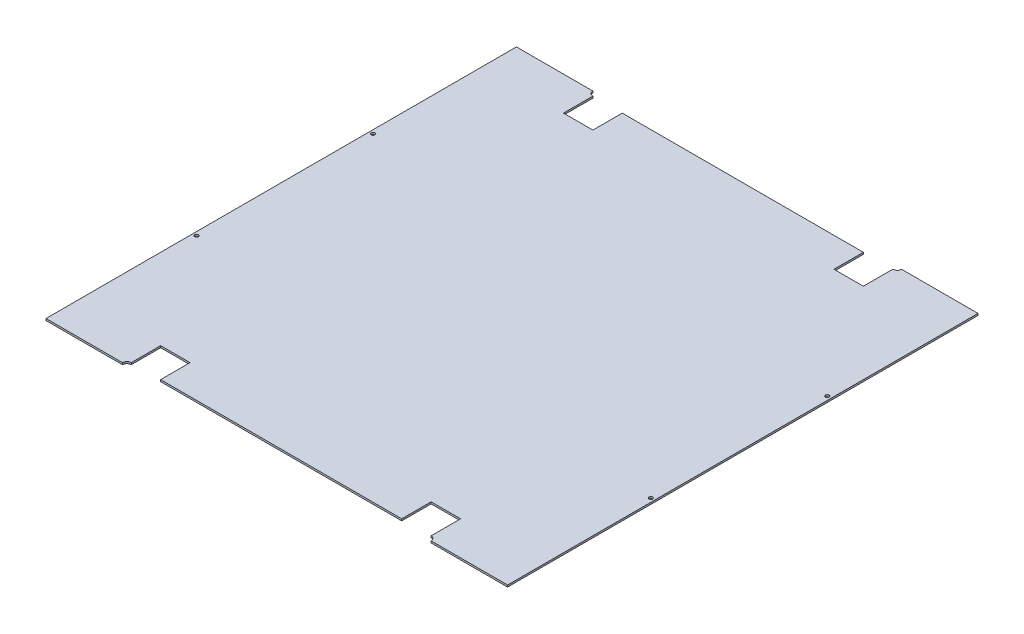
ISO-10303-21;
HEADER;
FILE_DESCRIPTION(('STEP AP214'),'2;1');
FILE_NAME('part.step','',(''),(''),'','','');
FILE_SCHEMA(('AUTOMOTIVE_DESIGN { 1 0 10303 214 1 1 1 1 }'));
ENDSEC;
DATA;
#1=APPLICATION_CONTEXT('core data for automotive mechanical design processes');
#2=APPLICATION_PROTOCOL_DEFINITION('international standard','automotive_design',2000,#1);
#3=PRODUCT_CONTEXT('',#1,'mechanical');
#4=PRODUCT('Part','Part','',(#3));
#5=PRODUCT_RELATED_PRODUCT_CATEGORY('part','',(#4));
#6=PRODUCT_DEFINITION_FORMATION('','',#4);
#7=PRODUCT_DEFINITION_CONTEXT('part definition',#1,'design');
#8=PRODUCT_DEFINITION('design','',#6,#7);
#9=PRODUCT_DEFINITION_SHAPE('','',#8);
#10=(LENGTH_UNIT() NAMED_UNIT(*) SI_UNIT(.MILLI.,.METRE.));
#11=(NAMED_UNIT(*) PLANE_ANGLE_UNIT() SI_UNIT($,.RADIAN.));
#12=(NAMED_UNIT(*) SI_UNIT($,.STERADIAN.) SOLID_ANGLE_UNIT());
#13=UNCERTAINTY_MEASURE_WITH_UNIT(LENGTH_MEASURE(1.E-05),#10,'distance_accuracy_value','');
#14=(GEOMETRIC_REPRESENTATION_CONTEXT(3) GLOBAL_UNCERTAINTY_ASSIGNED_CONTEXT((#13)) GLOBAL_UNIT_ASSIGNED_CONTEXT((#10,
#11,#12)) REPRESENTATION_CONTEXT('',''));
#15=CARTESIAN_POINT('',(0.,0.,0.));
#16=DIRECTION('',(0.,0.,1.));
#17=DIRECTION('',(1.,0.,0.));
#18=AXIS2_PLACEMENT_3D('',#15,#16,#17);
#19=CARTESIAN_POINT('',(126.537845956828,1.5875,-206.259520043997));
#20=DIRECTION('',(0.,-1.,0.));
#21=DIRECTION('',(0.,0.,-1.));
#22=AXIS2_PLACEMENT_3D('',#19,#20,#21);
#23=CYLINDRICAL_SURFACE('',#22,3.81000000000001);
#24=CARTESIAN_POINT('',(126.537845956828,0.,-206.259520043997));
#25=DIRECTION('',(0.,1.,0.));
#26=DIRECTION('',(0.,0.,1.));
#27=AXIS2_PLACEMENT_3D('',#24,#25,#26);
#28=CIRCLE('',#27,3.81000000000001);
#29=CARTESIAN_POINT('',(126.537845956828,0.,-202.449520043997));
#30=VERTEX_POINT('',#29);
#31=CARTESIAN_POINT('',(130.347845956828,0.,-206.259520043997));
#32=VERTEX_POINT('',#31);
#33=EDGE_CURVE('E231',#30,#32,#28,.T.);
#34=ORIENTED_EDGE('',*,*,#33,.F.);
#35=DIRECTION('',(0.,-1.,0.));
#36=VECTOR('',#35,1.);
#37=CARTESIAN_POINT('',(126.537845956828,1.5875,-202.449520043997));
#38=LINE('',#37,#36);
#39=CARTESIAN_POINT('',(126.537845956828,1.5875,-202.449520043997));
#40=VERTEX_POINT('',#39);
#41=EDGE_CURVE('E11',#40,#30,#38,.T.);
#42=ORIENTED_EDGE('',*,*,#41,.F.);
#43=CARTESIAN_POINT('',(126.537845956828,1.5875,-206.259520043997));
#44=DIRECTION('',(0.,1.,0.));
#45=DIRECTION('',(0.,0.,1.));
#46=AXIS2_PLACEMENT_3D('',#43,#44,#45);
#47=CIRCLE('',#46,3.81000000000001);
#48=CARTESIAN_POINT('',(130.347845956828,1.5875,-206.259520043997));
#49=VERTEX_POINT('',#48);
#50=EDGE_CURVE('E361',#40,#49,#47,.T.);
#51=ORIENTED_EDGE('',*,*,#50,.T.);
#52=DIRECTION('',(0.,-1.,0.));
#53=VECTOR('',#52,1.);
#54=CARTESIAN_POINT('',(130.347845956828,1.5875,-206.259520043997));
#55=LINE('',#54,#53);
#56=EDGE_CURVE('E55',#49,#32,#55,.T.);
#57=ORIENTED_EDGE('',*,*,#56,.T.);
#58=EDGE_LOOP('',(#34,#42,#51,#57));
#59=FACE_BOUND('',#58,.T.);
#60=ADVANCED_FACE('F39',(#59),#23,.F.);
#61=CARTESIAN_POINT('',(126.537845956828,1.5875,1.2023727325209E-13));
#62=DIRECTION('',(1.,0.,0.));
#63=DIRECTION('',(0.,0.,-1.));
#64=AXIS2_PLACEMENT_3D('',#61,#62,#63);
#65=PLANE('',#64);
#66=DIRECTION('',(0.,0.,1.));
#67=VECTOR('',#66,1.);
#68=CARTESIAN_POINT('',(126.537845956828,0.,1.2023727325209E-13));
#69=LINE('',#68,#67);
#70=CARTESIAN_POINT('',(126.537845956828,0.,-177.049520043997));
#71=VERTEX_POINT('',#70);
#72=EDGE_CURVE('E233',#30,#71,#69,.T.);
#73=ORIENTED_EDGE('',*,*,#72,.T.);
#74=DIRECTION('',(0.,-1.,0.));
#75=VECTOR('',#74,1.);
#76=CARTESIAN_POINT('',(126.537845956828,1.5875,-177.049520043997));
#77=LINE('',#76,#75);
#78=CARTESIAN_POINT('',(126.537845956828,1.5875,-177.049520043997));
#79=VERTEX_POINT('',#78);
#80=EDGE_CURVE('E47',#79,#71,#77,.T.);
#81=ORIENTED_EDGE('',*,*,#80,.F.);
#82=DIRECTION('',(0.,0.,1.));
#83=VECTOR('',#82,1.);
#84=CARTESIAN_POINT('',(126.537845956828,1.5875,1.2023727325209E-13));
#85=LINE('',#84,#83);
#86=EDGE_CURVE('E357',#40,#79,#85,.T.);
#87=ORIENTED_EDGE('',*,*,#86,.F.);
#88=ORIENTED_EDGE('',*,*,#41,.T.);
#89=EDGE_LOOP('',(#73,#81,#87,#88));
#90=FACE_BOUND('',#89,.T.);
#91=ADVANCED_FACE('F344',(#90),#65,.F.);
#92=CARTESIAN_POINT('',(-1.93468950444566E-13,1.5875,-177.049520043997));
#93=DIRECTION('',(0.,0.,-1.));
#94=DIRECTION('',(-1.,0.,0.));
#95=AXIS2_PLACEMENT_3D('',#92,#93,#94);
#96=PLANE('',#95);
#97=DIRECTION('',(1.,0.,0.));
#98=VECTOR('',#97,1.);
#99=CARTESIAN_POINT('',(-1.93468950444566E-13,0.,-177.049520043997));
#100=LINE('',#99,#98);
#101=CARTESIAN_POINT('',(101.137845956828,0.,-177.049520043997));
#102=VERTEX_POINT('',#101);
#103=EDGE_CURVE('E237',#102,#71,#100,.T.);
#104=ORIENTED_EDGE('',*,*,#103,.F.);
#105=DIRECTION('',(0.,-1.,0.));
#106=VECTOR('',#105,1.);
#107=CARTESIAN_POINT('',(101.137845956828,1.5875,-177.049520043997));
#108=LINE('',#107,#106);
#109=CARTESIAN_POINT('',(101.137845956828,1.5875,-177.049520043997));
#110=VERTEX_POINT('',#109);
#111=EDGE_CURVE('E334',#110,#102,#108,.T.);
#112=ORIENTED_EDGE('',*,*,#111,.F.);
#113=DIRECTION('',(1.,0.,0.));
#114=VECTOR('',#113,1.);
#115=CARTESIAN_POINT('',(-1.93468950444566E-13,1.5875,-177.049520043997));
#116=LINE('',#115,#114);
#117=EDGE_CURVE('E341',#110,#79,#116,.T.);
#118=ORIENTED_EDGE('',*,*,#117,.T.);
#119=ORIENTED_EDGE('',*,*,#80,.T.);
#120=EDGE_LOOP('',(#104,#112,#118,#119));
#121=FACE_BOUND('',#120,.T.);
#122=ADVANCED_FACE('F339',(#121),#96,.T.);
#123=CARTESIAN_POINT('',(101.137845956828,1.5875,0.));
#124=DIRECTION('',(1.,0.,0.));
#125=DIRECTION('',(0.,0.,-1.));
#126=AXIS2_PLACEMENT_3D('',#123,#124,#125);
#127=PLANE('',#126);
#128=DIRECTION('',(0.,0.,1.));
#129=VECTOR('',#128,1.);
#130=CARTESIAN_POINT('',(101.137845956828,0.,0.));
#131=LINE('',#130,#129);
#132=CARTESIAN_POINT('',(101.137845956828,0.,-202.449520043997));
#133=VERTEX_POINT('',#132);
#134=EDGE_CURVE('E240',#133,#102,#131,.T.);
#135=ORIENTED_EDGE('',*,*,#134,.F.);
#136=DIRECTION('',(0.,-1.,0.));
#137=VECTOR('',#136,1.);
#138=CARTESIAN_POINT('',(101.137845956828,1.5875,-202.449520043997));
#139=LINE('',#138,#137);
#140=CARTESIAN_POINT('',(101.137845956828,1.5875,-202.449520043997));
#141=VERTEX_POINT('',#140);
#142=EDGE_CURVE('E332',#141,#133,#139,.T.);
#143=ORIENTED_EDGE('',*,*,#142,.F.);
#144=DIRECTION('',(0.,0.,1.));
#145=VECTOR('',#144,1.);
#146=CARTESIAN_POINT('',(101.137845956828,1.5875,0.));
#147=LINE('',#146,#145);
#148=EDGE_CURVE('E354',#141,#110,#147,.T.);
#149=ORIENTED_EDGE('',*,*,#148,.T.);
#150=ORIENTED_EDGE('',*,*,#111,.T.);
#151=EDGE_LOOP('',(#135,#143,#149,#150));
#152=FACE_BOUND('',#151,.T.);
#153=ADVANCED_FACE('F351',(#152),#127,.T.);
#154=CARTESIAN_POINT('',(0.,1.5875,-202.449520043997));
#155=DIRECTION('',(0.,0.,-1.));
#156=DIRECTION('',(-1.,0.,0.));
#157=AXIS2_PLACEMENT_3D('',#154,#155,#156);
#158=PLANE('',#157);
#159=DIRECTION('',(1.,0.,0.));
#160=VECTOR('',#159,1.);
#161=CARTESIAN_POINT('',(0.,0.,-202.449520043997));
#162=LINE('',#161,#160);
#163=CARTESIAN_POINT('',(-107.142154043172,0.,-202.449520043997));
#164=VERTEX_POINT('',#163);
#165=EDGE_CURVE('E243',#164,#133,#162,.T.);
#166=ORIENTED_EDGE('',*,*,#165,.F.);
#167=DIRECTION('',(0.,-1.,0.));
#168=VECTOR('',#167,1.);
#169=CARTESIAN_POINT('',(-107.142154043172,1.5875,-202.449520043997));
#170=LINE('',#169,#168);
#171=CARTESIAN_POINT('',(-107.142154043172,1.5875,-202.449520043997));
#172=VERTEX_POINT('',#171);
#173=EDGE_CURVE('E330',#172,#164,#170,.T.);
#174=ORIENTED_EDGE('',*,*,#173,.F.);
#175=DIRECTION('',(1.,0.,0.));
#176=VECTOR('',#175,1.);
#177=CARTESIAN_POINT('',(0.,1.5875,-202.449520043997));
#178=LINE('',#177,#176);
#179=EDGE_CURVE('E359',#172,#141,#178,.T.);
#180=ORIENTED_EDGE('',*,*,#179,.T.);
#181=ORIENTED_EDGE('',*,*,#142,.T.);
#182=EDGE_LOOP('',(#166,#174,#180,#181));
#183=FACE_BOUND('',#182,.T.);
#184=ADVANCED_FACE('F467',(#183),#158,.T.);
#185=CARTESIAN_POINT('',(-107.142154043172,1.5875,1.52710997509413E-13));
#186=DIRECTION('',(1.,0.,0.));
#187=DIRECTION('',(0.,0.,-1.));
#188=AXIS2_PLACEMENT_3D('',#185,#186,#187);
#189=PLANE('',#188);
#190=DIRECTION('',(0.,0.,1.));
#191=VECTOR('',#190,1.);
#192=CARTESIAN_POINT('',(-107.142154043172,0.,1.52710997509413E-13));
#193=LINE('',#192,#191);
#194=CARTESIAN_POINT('',(-107.142154043172,0.,-177.049520043997));
#195=VERTEX_POINT('',#194);
#196=EDGE_CURVE('E246',#164,#195,#193,.T.);
#197=ORIENTED_EDGE('',*,*,#196,.T.);
#198=DIRECTION('',(0.,-1.,0.));
#199=VECTOR('',#198,1.);
#200=CARTESIAN_POINT('',(-107.142154043172,1.5875,-177.049520043997));
#201=LINE('',#200,#199);
#202=CARTESIAN_POINT('',(-107.142154043172,1.5875,-177.049520043997));
#203=VERTEX_POINT('',#202);
#204=EDGE_CURVE('E328',#203,#195,#201,.T.);
#205=ORIENTED_EDGE('',*,*,#204,.F.);
#206=DIRECTION('',(0.,0.,1.));
#207=VECTOR('',#206,1.);
#208=CARTESIAN_POINT('',(-107.142154043172,1.5875,1.52710997509413E-13));
#209=LINE('',#208,#207);
#210=EDGE_CURVE('E366',#172,#203,#209,.T.);
#211=ORIENTED_EDGE('',*,*,#210,.F.);
#212=ORIENTED_EDGE('',*,*,#173,.T.);
#213=EDGE_LOOP('',(#197,#205,#211,#212));
#214=FACE_BOUND('',#213,.T.);
#215=ADVANCED_FACE('F470',(#214),#189,.F.);
#216=CARTESIAN_POINT('',(0.,1.5875,-177.049520043997));
#217=DIRECTION('',(0.,0.,-1.));
#218=DIRECTION('',(-1.,0.,0.));
#219=AXIS2_PLACEMENT_3D('',#216,#217,#218);
#220=PLANE('',#219);
#221=DIRECTION('',(1.,0.,0.));
#222=VECTOR('',#221,1.);
#223=CARTESIAN_POINT('',(0.,0.,-177.049520043997));
#224=LINE('',#223,#222);
#225=CARTESIAN_POINT('',(-132.542154043172,0.,-177.049520043997));
#226=VERTEX_POINT('',#225);
#227=EDGE_CURVE('E249',#226,#195,#224,.T.);
#228=ORIENTED_EDGE('',*,*,#227,.F.);
#229=DIRECTION('',(0.,-1.,0.));
#230=VECTOR('',#229,1.);
#231=CARTESIAN_POINT('',(-132.542154043172,1.5875,-177.049520043997));
#232=LINE('',#231,#230);
#233=CARTESIAN_POINT('',(-132.542154043172,1.5875,-177.049520043997));
#234=VERTEX_POINT('',#233);
#235=EDGE_CURVE('E326',#234,#226,#232,.T.);
#236=ORIENTED_EDGE('',*,*,#235,.F.);
#237=DIRECTION('',(1.,0.,0.));
#238=VECTOR('',#237,1.);
#239=CARTESIAN_POINT('',(0.,1.5875,-177.049520043997));
#240=LINE('',#239,#238);
#241=EDGE_CURVE('E368',#234,#203,#240,.T.);
#242=ORIENTED_EDGE('',*,*,#241,.T.);
#243=ORIENTED_EDGE('',*,*,#204,.T.);
#244=EDGE_LOOP('',(#228,#236,#242,#243));
#245=FACE_BOUND('',#244,.T.);
#246=ADVANCED_FACE('F474',(#245),#220,.T.);
#247=CARTESIAN_POINT('',(-132.542154043172,1.5875,1.25942614816967E-13));
#248=DIRECTION('',(1.,0.,0.));
#249=DIRECTION('',(0.,0.,-1.));
#250=AXIS2_PLACEMENT_3D('',#247,#248,#249);
#251=PLANE('',#250);
#252=DIRECTION('',(0.,0.,1.));
#253=VECTOR('',#252,1.);
#254=CARTESIAN_POINT('',(-132.542154043172,0.,1.25942614816967E-13));
#255=LINE('',#254,#253);
#256=CARTESIAN_POINT('',(-132.542154043172,0.,-202.449520043997));
#257=VERTEX_POINT('',#256);
#258=EDGE_CURVE('E252',#257,#226,#255,.T.);
#259=ORIENTED_EDGE('',*,*,#258,.F.);
#260=DIRECTION('',(0.,-1.,0.));
#261=VECTOR('',#260,1.);
#262=CARTESIAN_POINT('',(-132.542154043172,1.5875,-202.449520043997));
#263=LINE('',#262,#261);
#264=CARTESIAN_POINT('',(-132.542154043172,1.5875,-202.449520043997));
#265=VERTEX_POINT('',#264);
#266=EDGE_CURVE('E324',#265,#257,#263,.T.);
#267=ORIENTED_EDGE('',*,*,#266,.F.);
#268=DIRECTION('',(0.,0.,1.));
#269=VECTOR('',#268,1.);
#270=CARTESIAN_POINT('',(-132.542154043172,1.5875,1.25942614816967E-13));
#271=LINE('',#270,#269);
#272=EDGE_CURVE('E371',#265,#234,#271,.T.);
#273=ORIENTED_EDGE('',*,*,#272,.T.);
#274=ORIENTED_EDGE('',*,*,#235,.T.);
#275=EDGE_LOOP('',(#259,#267,#273,#274));
#276=FACE_BOUND('',#275,.T.);
#277=ADVANCED_FACE('F478',(#276),#251,.T.);
#278=CARTESIAN_POINT('',(-132.542154043172,1.5875,-206.259520043997));
#279=DIRECTION('',(0.,-1.,0.));
#280=DIRECTION('',(0.,0.,-1.));
#281=AXIS2_PLACEMENT_3D('',#278,#279,#280);
#282=CYLINDRICAL_SURFACE('',#281,3.81000000000001);
#283=CARTESIAN_POINT('',(-132.542154043172,0.,-206.259520043997));
#284=DIRECTION('',(0.,1.,0.));
#285=DIRECTION('',(0.,0.,1.));
#286=AXIS2_PLACEMENT_3D('',#283,#284,#285);
#287=CIRCLE('',#286,3.81000000000001);
#288=CARTESIAN_POINT('',(-136.352154043172,0.,-206.259520043997));
#289=VERTEX_POINT('',#288);
#290=EDGE_CURVE('E255',#289,#257,#287,.T.);
#291=ORIENTED_EDGE('',*,*,#290,.F.);
#292=DIRECTION('',(0.,-1.,0.));
#293=VECTOR('',#292,1.);
#294=CARTESIAN_POINT('',(-136.352154043172,1.5875,-206.259520043997));
#295=LINE('',#294,#293);
#296=CARTESIAN_POINT('',(-136.352154043172,1.5875,-206.259520043997));
#297=VERTEX_POINT('',#296);
#298=EDGE_CURVE('E322',#297,#289,#295,.T.);
#299=ORIENTED_EDGE('',*,*,#298,.F.);
#300=CARTESIAN_POINT('',(-132.542154043172,1.5875,-206.259520043997));
#301=DIRECTION('',(0.,1.,0.));
#302=DIRECTION('',(0.,0.,1.));
#303=AXIS2_PLACEMENT_3D('',#300,#301,#302);
#304=CIRCLE('',#303,3.81000000000001);
#305=EDGE_CURVE('E374',#297,#265,#304,.T.);
#306=ORIENTED_EDGE('',*,*,#305,.T.);
#307=ORIENTED_EDGE('',*,*,#266,.T.);
#308=EDGE_LOOP('',(#291,#299,#306,#307));
#309=FACE_BOUND('',#308,.T.);
#310=ADVANCED_FACE('F482',(#309),#282,.F.);
#311=CARTESIAN_POINT('',(0.,1.5875,-206.259520043997));
#312=DIRECTION('',(0.,0.,-1.));
#313=DIRECTION('',(-1.,0.,0.));
#314=AXIS2_PLACEMENT_3D('',#311,#312,#313);
#315=PLANE('',#314);
#316=DIRECTION('',(1.,0.,0.));
#317=VECTOR('',#316,1.);
#318=CARTESIAN_POINT('',(0.,0.,-206.259520043997));
#319=LINE('',#318,#317);
#320=CARTESIAN_POINT('',(-202.392154043172,0.,-206.259520043997));
#321=VERTEX_POINT('',#320);
#322=EDGE_CURVE('E258',#321,#289,#319,.T.);
#323=ORIENTED_EDGE('',*,*,#322,.F.);
#324=DIRECTION('',(0.,-1.,0.));
#325=VECTOR('',#324,1.);
#326=CARTESIAN_POINT('',(-202.392154043172,1.5875,-206.259520043997));
#327=LINE('',#326,#325);
#328=CARTESIAN_POINT('',(-202.392154043172,1.5875,-206.259520043997));
#329=VERTEX_POINT('',#328);
#330=EDGE_CURVE('E320',#329,#321,#327,.T.);
#331=ORIENTED_EDGE('',*,*,#330,.F.);
#332=DIRECTION('',(1.,0.,0.));
#333=VECTOR('',#332,1.);
#334=CARTESIAN_POINT('',(0.,1.5875,-206.259520043997));
#335=LINE('',#334,#333);
#336=EDGE_CURVE('E227',#329,#297,#335,.T.);
#337=ORIENTED_EDGE('',*,*,#336,.T.);
#338=ORIENTED_EDGE('',*,*,#298,.T.);
#339=EDGE_LOOP('',(#323,#331,#337,#338));
#340=FACE_BOUND('',#339,.T.);
#341=ADVANCED_FACE('F486',(#340),#315,.T.);
#342=CARTESIAN_POINT('',(-202.392154043172,1.5875,0.));
#343=DIRECTION('',(1.,0.,0.));
#344=DIRECTION('',(0.,0.,-1.));
#345=AXIS2_PLACEMENT_3D('',#342,#343,#344);
#346=PLANE('',#345);
#347=DIRECTION('',(0.,0.,1.));
#348=VECTOR('',#347,1.);
#349=CARTESIAN_POINT('',(-202.392154043172,0.,0.));
#350=LINE('',#349,#348);
#351=CARTESIAN_POINT('',(-202.392154043172,0.,200.140479956003));
#352=VERTEX_POINT('',#351);
#353=EDGE_CURVE('E261',#321,#352,#350,.T.);
#354=ORIENTED_EDGE('',*,*,#353,.T.);
#355=DIRECTION('',(0.,-1.,0.));
#356=VECTOR('',#355,1.);
#357=CARTESIAN_POINT('',(-202.392154043172,1.5875,200.140479956003));
#358=LINE('',#357,#356);
#359=CARTESIAN_POINT('',(-202.392154043172,1.5875,200.140479956003));
#360=VERTEX_POINT('',#359);
#361=EDGE_CURVE('E317',#360,#352,#358,.T.);
#362=ORIENTED_EDGE('',*,*,#361,.F.);
#363=DIRECTION('',(0.,0.,1.));
#364=VECTOR('',#363,1.);
#365=CARTESIAN_POINT('',(-202.392154043172,1.5875,0.));
#366=LINE('',#365,#364);
#367=EDGE_CURVE('E378',#329,#360,#366,.T.);
#368=ORIENTED_EDGE('',*,*,#367,.F.);
#369=ORIENTED_EDGE('',*,*,#330,.T.);
#370=EDGE_LOOP('',(#354,#362,#368,#369));
#371=FACE_BOUND('',#370,.T.);
#372=ADVANCED_FACE('F488',(#371),#346,.F.);
#373=CARTESIAN_POINT('',(0.,1.5875,200.140479956003));
#374=DIRECTION('',(0.,0.,-1.));
#375=DIRECTION('',(-1.,0.,0.));
#376=AXIS2_PLACEMENT_3D('',#373,#374,#375);
#377=PLANE('',#376);
#378=DIRECTION('',(1.,0.,0.));
#379=VECTOR('',#378,1.);
#380=CARTESIAN_POINT('',(0.,0.,200.140479956003));
#381=LINE('',#380,#379);
#382=CARTESIAN_POINT('',(-136.352154043172,0.,200.140479956003));
#383=VERTEX_POINT('',#382);
#384=EDGE_CURVE('E264',#352,#383,#381,.T.);
#385=ORIENTED_EDGE('',*,*,#384,.T.);
#386=DIRECTION('',(0.,-1.,0.));
#387=VECTOR('',#386,1.);
#388=CARTESIAN_POINT('',(-136.352154043172,1.5875,200.140479956003));
#389=LINE('',#388,#387);
#390=CARTESIAN_POINT('',(-136.352154043172,1.5875,200.140479956003));
#391=VERTEX_POINT('',#390);
#392=EDGE_CURVE('E315',#391,#383,#389,.T.);
#393=ORIENTED_EDGE('',*,*,#392,.F.);
#394=DIRECTION('',(1.,0.,0.));
#395=VECTOR('',#394,1.);
#396=CARTESIAN_POINT('',(0.,1.5875,200.140479956003));
#397=LINE('',#396,#395);
#398=EDGE_CURVE('E213',#360,#391,#397,.T.);
#399=ORIENTED_EDGE('',*,*,#398,.F.);
#400=ORIENTED_EDGE('',*,*,#361,.T.);
#401=EDGE_LOOP('',(#385,#393,#399,#400));
#402=FACE_BOUND('',#401,.T.);
#403=ADVANCED_FACE('F491',(#402),#377,.F.);
#404=CARTESIAN_POINT('',(-132.542154043172,1.5875,200.140479956003));
#405=DIRECTION('',(0.,-1.,0.));
#406=DIRECTION('',(0.,0.,-1.));
#407=AXIS2_PLACEMENT_3D('',#404,#405,#406);
#408=CYLINDRICAL_SURFACE('',#407,3.80999999999998);
#409=CARTESIAN_POINT('',(-132.542154043172,0.,200.140479956003));
#410=DIRECTION('',(0.,1.,0.));
#411=DIRECTION('',(0.,0.,1.));
#412=AXIS2_PLACEMENT_3D('',#409,#410,#411);
#413=CIRCLE('',#412,3.80999999999998);
#414=CARTESIAN_POINT('',(-132.542154043172,0.,196.330479956003));
#415=VERTEX_POINT('',#414);
#416=EDGE_CURVE('E267',#415,#383,#413,.T.);
#417=ORIENTED_EDGE('',*,*,#416,.F.);
#418=DIRECTION('',(0.,-1.,0.));
#419=VECTOR('',#418,1.);
#420=CARTESIAN_POINT('',(-132.542154043172,1.5875,196.330479956003));
#421=LINE('',#420,#419);
#422=CARTESIAN_POINT('',(-132.542154043172,1.5875,196.330479956003));
#423=VERTEX_POINT('',#422);
#424=EDGE_CURVE('E313',#423,#415,#421,.T.);
#425=ORIENTED_EDGE('',*,*,#424,.F.);
#426=CARTESIAN_POINT('',(-132.542154043172,1.5875,200.140479956003));
#427=DIRECTION('',(0.,1.,0.));
#428=DIRECTION('',(0.,0.,1.));
#429=AXIS2_PLACEMENT_3D('',#426,#427,#428);
#430=CIRCLE('',#429,3.80999999999998);
#431=EDGE_CURVE('E380',#423,#391,#430,.T.);
#432=ORIENTED_EDGE('',*,*,#431,.T.);
#433=ORIENTED_EDGE('',*,*,#392,.T.);
#434=EDGE_LOOP('',(#417,#425,#432,#433));
#435=FACE_BOUND('',#434,.T.);
#436=ADVANCED_FACE('F493',(#435),#408,.F.);
#437=CARTESIAN_POINT('',(-132.542154043172,1.5875,1.25942614816967E-13));
#438=DIRECTION('',(1.,0.,0.));
#439=DIRECTION('',(0.,0.,-1.));
#440=AXIS2_PLACEMENT_3D('',#437,#438,#439);
#441=PLANE('',#440);
#442=DIRECTION('',(0.,0.,1.));
#443=VECTOR('',#442,1.);
#444=CARTESIAN_POINT('',(-132.542154043172,0.,1.25942614816967E-13));
#445=LINE('',#444,#443);
#446=CARTESIAN_POINT('',(-132.542154043172,0.,170.930479956003));
#447=VERTEX_POINT('',#446);
#448=EDGE_CURVE('E270',#447,#415,#445,.T.);
#449=ORIENTED_EDGE('',*,*,#448,.F.);
#450=DIRECTION('',(0.,-1.,0.));
#451=VECTOR('',#450,1.);
#452=CARTESIAN_POINT('',(-132.542154043172,1.5875,170.930479956003));
#453=LINE('',#452,#451);
#454=CARTESIAN_POINT('',(-132.542154043172,1.5875,170.930479956003));
#455=VERTEX_POINT('',#454);
#456=EDGE_CURVE('E311',#455,#447,#453,.T.);
#457=ORIENTED_EDGE('',*,*,#456,.F.);
#458=DIRECTION('',(0.,0.,1.));
#459=VECTOR('',#458,1.);
#460=CARTESIAN_POINT('',(-132.542154043172,1.5875,1.25942614816967E-13));
#461=LINE('',#460,#459);
#462=EDGE_CURVE('E383',#455,#423,#461,.T.);
#463=ORIENTED_EDGE('',*,*,#462,.T.);
#464=ORIENTED_EDGE('',*,*,#424,.T.);
#465=EDGE_LOOP('',(#449,#457,#463,#464));
#466=FACE_BOUND('',#465,.T.);
#467=ADVANCED_FACE('F496',(#466),#441,.T.);
#468=CARTESIAN_POINT('',(-1.8678243548955E-13,1.5875,170.930479956003));
#469=DIRECTION('',(0.,0.,-1.));
#470=DIRECTION('',(-1.,0.,0.));
#471=AXIS2_PLACEMENT_3D('',#468,#469,#470);
#472=PLANE('',#471);
#473=DIRECTION('',(1.,0.,0.));
#474=VECTOR('',#473,1.);
#475=CARTESIAN_POINT('',(-1.8678243548955E-13,0.,170.930479956003));
#476=LINE('',#475,#474);
#477=CARTESIAN_POINT('',(-107.142154043172,0.,170.930479956003));
#478=VERTEX_POINT('',#477);
#479=EDGE_CURVE('E273',#447,#478,#476,.T.);
#480=ORIENTED_EDGE('',*,*,#479,.T.);
#481=DIRECTION('',(0.,-1.,0.));
#482=VECTOR('',#481,1.);
#483=CARTESIAN_POINT('',(-107.142154043172,1.5875,170.930479956003));
#484=LINE('',#483,#482);
#485=CARTESIAN_POINT('',(-107.142154043172,1.5875,170.930479956003));
#486=VERTEX_POINT('',#485);
#487=EDGE_CURVE('E308',#486,#478,#484,.T.);
#488=ORIENTED_EDGE('',*,*,#487,.F.);
#489=DIRECTION('',(1.,0.,0.));
#490=VECTOR('',#489,1.);
#491=CARTESIAN_POINT('',(-1.8678243548955E-13,1.5875,170.930479956003));
#492=LINE('',#491,#490);
#493=EDGE_CURVE('E386',#455,#486,#492,.T.);
#494=ORIENTED_EDGE('',*,*,#493,.F.);
#495=ORIENTED_EDGE('',*,*,#456,.T.);
#496=EDGE_LOOP('',(#480,#488,#494,#495));
#497=FACE_BOUND('',#496,.T.);
#498=ADVANCED_FACE('F500',(#497),#472,.F.);
#499=CARTESIAN_POINT('',(-107.142154043172,1.5875,0.));
#500=DIRECTION('',(1.,0.,0.));
#501=DIRECTION('',(0.,0.,-1.));
#502=AXIS2_PLACEMENT_3D('',#499,#500,#501);
#503=PLANE('',#502);
#504=DIRECTION('',(0.,0.,1.));
#505=VECTOR('',#504,1.);
#506=CARTESIAN_POINT('',(-107.142154043172,0.,0.));
#507=LINE('',#506,#505);
#508=CARTESIAN_POINT('',(-107.142154043172,0.,196.330479956003));
#509=VERTEX_POINT('',#508);
#510=EDGE_CURVE('E275',#478,#509,#507,.T.);
#511=ORIENTED_EDGE('',*,*,#510,.T.);
#512=DIRECTION('',(0.,-1.,0.));
#513=VECTOR('',#512,1.);
#514=CARTESIAN_POINT('',(-107.142154043172,1.5875,196.330479956003));
#515=LINE('',#514,#513);
#516=CARTESIAN_POINT('',(-107.142154043172,1.5875,196.330479956003));
#517=VERTEX_POINT('',#516);
#518=EDGE_CURVE('E305',#517,#509,#515,.T.);
#519=ORIENTED_EDGE('',*,*,#518,.F.);
#520=DIRECTION('',(0.,0.,1.));
#521=VECTOR('',#520,1.);
#522=CARTESIAN_POINT('',(-107.142154043172,1.5875,0.));
#523=LINE('',#522,#521);
#524=EDGE_CURVE('E388',#486,#517,#523,.T.);
#525=ORIENTED_EDGE('',*,*,#524,.F.);
#526=ORIENTED_EDGE('',*,*,#487,.T.);
#527=EDGE_LOOP('',(#511,#519,#525,#526));
#528=FACE_BOUND('',#527,.T.);
#529=ADVANCED_FACE('F504',(#528),#503,.F.);
#530=CARTESIAN_POINT('',(0.,1.5875,196.330479956003));
#531=DIRECTION('',(0.,0.,-1.));
#532=DIRECTION('',(-1.,0.,0.));
#533=AXIS2_PLACEMENT_3D('',#530,#531,#532);
#534=PLANE('',#533);
#535=DIRECTION('',(1.,0.,0.));
#536=VECTOR('',#535,1.);
#537=CARTESIAN_POINT('',(0.,0.,196.330479956003));
#538=LINE('',#537,#536);
#539=CARTESIAN_POINT('',(101.137845956828,0.,196.330479956003));
#540=VERTEX_POINT('',#539);
#541=EDGE_CURVE('E277',#509,#540,#538,.T.);
#542=ORIENTED_EDGE('',*,*,#541,.T.);
#543=DIRECTION('',(0.,-1.,0.));
#544=VECTOR('',#543,1.);
#545=CARTESIAN_POINT('',(101.137845956828,1.5875,196.330479956003));
#546=LINE('',#545,#544);
#547=CARTESIAN_POINT('',(101.137845956828,1.5875,196.330479956003));
#548=VERTEX_POINT('',#547);
#549=EDGE_CURVE('E303',#548,#540,#546,.T.);
#550=ORIENTED_EDGE('',*,*,#549,.F.);
#551=DIRECTION('',(1.,0.,0.));
#552=VECTOR('',#551,1.);
#553=CARTESIAN_POINT('',(0.,1.5875,196.330479956003));
#554=LINE('',#553,#552);
#555=EDGE_CURVE('E390',#517,#548,#554,.T.);
#556=ORIENTED_EDGE('',*,*,#555,.F.);
#557=ORIENTED_EDGE('',*,*,#518,.T.);
#558=EDGE_LOOP('',(#542,#550,#556,#557));
#559=FACE_BOUND('',#558,.T.);
#560=ADVANCED_FACE('F508',(#559),#534,.F.);
#561=CARTESIAN_POINT('',(101.137845956828,1.5875,0.));
#562=DIRECTION('',(1.,0.,0.));
#563=DIRECTION('',(0.,0.,-1.));
#564=AXIS2_PLACEMENT_3D('',#561,#562,#563);
#565=PLANE('',#564);
#566=DIRECTION('',(0.,0.,1.));
#567=VECTOR('',#566,1.);
#568=CARTESIAN_POINT('',(101.137845956828,0.,0.));
#569=LINE('',#568,#567);
#570=CARTESIAN_POINT('',(101.137845956828,0.,170.930479956003));
#571=VERTEX_POINT('',#570);
#572=EDGE_CURVE('E280',#571,#540,#569,.T.);
#573=ORIENTED_EDGE('',*,*,#572,.F.);
#574=DIRECTION('',(0.,-1.,0.));
#575=VECTOR('',#574,1.);
#576=CARTESIAN_POINT('',(101.137845956828,1.5875,170.930479956003));
#577=LINE('',#576,#575);
#578=CARTESIAN_POINT('',(101.137845956828,1.5875,170.930479956003));
#579=VERTEX_POINT('',#578);
#580=EDGE_CURVE('E301',#579,#571,#577,.T.);
#581=ORIENTED_EDGE('',*,*,#580,.F.);
#582=DIRECTION('',(0.,0.,1.));
#583=VECTOR('',#582,1.);
#584=CARTESIAN_POINT('',(101.137845956828,1.5875,0.));
#585=LINE('',#584,#583);
#586=EDGE_CURVE('E392',#579,#548,#585,.T.);
#587=ORIENTED_EDGE('',*,*,#586,.T.);
#588=ORIENTED_EDGE('',*,*,#549,.T.);
#589=EDGE_LOOP('',(#573,#581,#587,#588));
#590=FACE_BOUND('',#589,.T.);
#591=ADVANCED_FACE('F512',(#590),#565,.T.);
#592=CARTESIAN_POINT('',(1.86782435489551E-13,1.5875,170.930479956003));
#593=DIRECTION('',(0.,0.,-1.));
#594=DIRECTION('',(-1.,0.,0.));
#595=AXIS2_PLACEMENT_3D('',#592,#593,#594);
#596=PLANE('',#595);
#597=DIRECTION('',(1.,0.,0.));
#598=VECTOR('',#597,1.);
#599=CARTESIAN_POINT('',(1.86782435489551E-13,0.,170.930479956003));
#600=LINE('',#599,#598);
#601=CARTESIAN_POINT('',(126.537845956828,0.,170.930479956003));
#602=VERTEX_POINT('',#601);
#603=EDGE_CURVE('E283',#571,#602,#600,.T.);
#604=ORIENTED_EDGE('',*,*,#603,.T.);
#605=DIRECTION('',(0.,-1.,0.));
#606=VECTOR('',#605,1.);
#607=CARTESIAN_POINT('',(126.537845956828,1.5875,170.930479956003));
#608=LINE('',#607,#606);
#609=CARTESIAN_POINT('',(126.537845956828,1.5875,170.930479956003));
#610=VERTEX_POINT('',#609);
#611=EDGE_CURVE('E298',#610,#602,#608,.T.);
#612=ORIENTED_EDGE('',*,*,#611,.F.);
#613=DIRECTION('',(1.,0.,0.));
#614=VECTOR('',#613,1.);
#615=CARTESIAN_POINT('',(1.86782435489551E-13,1.5875,170.930479956003));
#616=LINE('',#615,#614);
#617=EDGE_CURVE('E395',#579,#610,#616,.T.);
#618=ORIENTED_EDGE('',*,*,#617,.F.);
#619=ORIENTED_EDGE('',*,*,#580,.T.);
#620=EDGE_LOOP('',(#604,#612,#618,#619));
#621=FACE_BOUND('',#620,.T.);
#622=ADVANCED_FACE('F516',(#621),#596,.F.);
#623=CARTESIAN_POINT('',(126.537845956828,1.5875,-2.40474546504179E-13));
#624=DIRECTION('',(1.,0.,0.));
#625=DIRECTION('',(0.,0.,-1.));
#626=AXIS2_PLACEMENT_3D('',#623,#624,#625);
#627=PLANE('',#626);
#628=DIRECTION('',(0.,0.,1.));
#629=VECTOR('',#628,1.);
#630=CARTESIAN_POINT('',(126.537845956828,0.,-2.40474546504179E-13));
#631=LINE('',#630,#629);
#632=CARTESIAN_POINT('',(126.537845956828,0.,196.330479956003));
#633=VERTEX_POINT('',#632);
#634=EDGE_CURVE('E285',#602,#633,#631,.T.);
#635=ORIENTED_EDGE('',*,*,#634,.T.);
#636=DIRECTION('',(0.,-1.,0.));
#637=VECTOR('',#636,1.);
#638=CARTESIAN_POINT('',(126.537845956828,1.5875,196.330479956003));
#639=LINE('',#638,#637);
#640=CARTESIAN_POINT('',(126.537845956828,1.5875,196.330479956003));
#641=VERTEX_POINT('',#640);
#642=EDGE_CURVE('E296',#641,#633,#639,.T.);
#643=ORIENTED_EDGE('',*,*,#642,.F.);
#644=DIRECTION('',(0.,0.,1.));
#645=VECTOR('',#644,1.);
#646=CARTESIAN_POINT('',(126.537845956828,1.5875,-2.40474546504179E-13));
#647=LINE('',#646,#645);
#648=EDGE_CURVE('E396',#610,#641,#647,.T.);
#649=ORIENTED_EDGE('',*,*,#648,.F.);
#650=ORIENTED_EDGE('',*,*,#611,.T.);
#651=EDGE_LOOP('',(#635,#643,#649,#650));
#652=FACE_BOUND('',#651,.T.);
#653=ADVANCED_FACE('F520',(#652),#627,.F.);
#654=CARTESIAN_POINT('',(126.537845956828,1.5875,200.140479956003));
#655=DIRECTION('',(0.,-1.,0.));
#656=DIRECTION('',(0.,0.,-1.));
#657=AXIS2_PLACEMENT_3D('',#654,#655,#656);
#658=CYLINDRICAL_SURFACE('',#657,3.80999999999998);
#659=CARTESIAN_POINT('',(126.537845956828,0.,200.140479956003));
#660=DIRECTION('',(0.,1.,0.));
#661=DIRECTION('',(0.,0.,1.));
#662=AXIS2_PLACEMENT_3D('',#659,#660,#661);
#663=CIRCLE('',#662,3.80999999999998);
#664=CARTESIAN_POINT('',(130.347845956828,0.,200.140479956003));
#665=VERTEX_POINT('',#664);
#666=EDGE_CURVE('E288',#665,#633,#663,.T.);
#667=ORIENTED_EDGE('',*,*,#666,.F.);
#668=DIRECTION('',(0.,-1.,0.));
#669=VECTOR('',#668,1.);
#670=CARTESIAN_POINT('',(130.347845956828,1.5875,200.140479956003));
#671=LINE('',#670,#669);
#672=CARTESIAN_POINT('',(130.347845956828,1.5875,200.140479956003));
#673=VERTEX_POINT('',#672);
#674=EDGE_CURVE('E221',#673,#665,#671,.T.);
#675=ORIENTED_EDGE('',*,*,#674,.F.);
#676=CARTESIAN_POINT('',(126.537845956828,1.5875,200.140479956003));
#677=DIRECTION('',(0.,1.,0.));
#678=DIRECTION('',(0.,0.,1.));
#679=AXIS2_PLACEMENT_3D('',#676,#677,#678);
#680=CIRCLE('',#679,3.80999999999998);
#681=EDGE_CURVE('E210',#673,#641,#680,.T.);
#682=ORIENTED_EDGE('',*,*,#681,.T.);
#683=ORIENTED_EDGE('',*,*,#642,.T.);
#684=EDGE_LOOP('',(#667,#675,#682,#683));
#685=FACE_BOUND('',#684,.T.);
#686=ADVANCED_FACE('F401',(#685),#658,.F.);
#687=CARTESIAN_POINT('',(196.387845956828,0.,200.140479956003));
#688=VERTEX_POINT('',#687);
#689=EDGE_CURVE('E218',#665,#688,#381,.T.);
#690=ORIENTED_EDGE('',*,*,#689,.T.);
#691=DIRECTION('',(0.,-1.,0.));
#692=VECTOR('',#691,1.);
#693=CARTESIAN_POINT('',(196.387845956828,1.5875,200.140479956003));
#694=LINE('',#693,#692);
#695=CARTESIAN_POINT('',(196.387845956828,1.5875,200.140479956003));
#696=VERTEX_POINT('',#695);
#697=EDGE_CURVE('E215',#696,#688,#694,.T.);
#698=ORIENTED_EDGE('',*,*,#697,.F.);
#699=EDGE_CURVE('E202',#673,#696,#397,.T.);
#700=ORIENTED_EDGE('',*,*,#699,.F.);
#701=ORIENTED_EDGE('',*,*,#674,.T.);
#702=EDGE_LOOP('',(#690,#698,#700,#701));
#703=FACE_BOUND('',#702,.T.);
#704=ADVANCED_FACE('F216',(#703),#377,.F.);
#705=CARTESIAN_POINT('',(196.387845956828,1.5875,0.));
#706=DIRECTION('',(1.,0.,0.));
#707=DIRECTION('',(0.,0.,-1.));
#708=AXIS2_PLACEMENT_3D('',#705,#706,#707);
#709=PLANE('',#708);
#710=DIRECTION('',(0.,0.,1.));
#711=VECTOR('',#710,1.);
#712=CARTESIAN_POINT('',(196.387845956828,0.,0.));
#713=LINE('',#712,#711);
#714=CARTESIAN_POINT('',(196.387845956828,0.,-206.259520043997));
#715=VERTEX_POINT('',#714);
#716=EDGE_CURVE('E291',#715,#688,#713,.T.);
#717=ORIENTED_EDGE('',*,*,#716,.F.);
#718=DIRECTION('',(0.,-1.,0.));
#719=VECTOR('',#718,1.);
#720=CARTESIAN_POINT('',(196.387845956828,1.5875,-206.259520043997));
#721=LINE('',#720,#719);
#722=CARTESIAN_POINT('',(196.387845956828,1.5875,-206.259520043997));
#723=VERTEX_POINT('',#722);
#724=EDGE_CURVE('E128',#723,#715,#721,.T.);
#725=ORIENTED_EDGE('',*,*,#724,.F.);
#726=DIRECTION('',(0.,0.,1.));
#727=VECTOR('',#726,1.);
#728=CARTESIAN_POINT('',(196.387845956828,1.5875,0.));
#729=LINE('',#728,#727);
#730=EDGE_CURVE('E208',#723,#696,#729,.T.);
#731=ORIENTED_EDGE('',*,*,#730,.T.);
#732=ORIENTED_EDGE('',*,*,#697,.T.);
#733=EDGE_LOOP('',(#717,#725,#731,#732));
#734=FACE_BOUND('',#733,.T.);
#735=ADVANCED_FACE('F223',(#734),#709,.T.);
#736=EDGE_CURVE('E262',#32,#715,#319,.T.);
#737=ORIENTED_EDGE('',*,*,#736,.F.);
#738=ORIENTED_EDGE('',*,*,#56,.F.);
#739=EDGE_CURVE('E224',#49,#723,#335,.T.);
#740=ORIENTED_EDGE('',*,*,#739,.T.);
#741=ORIENTED_EDGE('',*,*,#724,.T.);
#742=EDGE_LOOP('',(#737,#738,#740,#741));
#743=FACE_BOUND('',#742,.T.);
#744=ADVANCED_FACE('F433',(#743),#315,.T.);
#745=CARTESIAN_POINT('',(0.,1.5875,0.));
#746=DIRECTION('',(0.,1.,0.));
#747=DIRECTION('',(0.,0.,1.));
#748=AXIS2_PLACEMENT_3D('',#745,#746,#747);
#749=PLANE('',#748);
#750=CARTESIAN_POINT('',(-199.217154043172,1.5875,-79.2595200439969));
#751=DIRECTION('',(0.,1.,0.));
#752=DIRECTION('',(0.,0.,1.));
#753=AXIS2_PLACEMENT_3D('',#750,#751,#752);
#754=CIRCLE('',#753,1.58749999999999);
#755=CARTESIAN_POINT('',(-199.217154043172,1.5875,-77.6720200439969));
#756=VERTEX_POINT('',#755);
#757=EDGE_CURVE('E425',#756,#756,#754,.T.);
#758=ORIENTED_EDGE('',*,*,#757,.F.);
#759=EDGE_LOOP('',(#758));
#760=FACE_BOUND('',#759,.T.);
#761=CARTESIAN_POINT('',(-199.217154043173,1.5875,73.1404799560031));
#762=DIRECTION('',(0.,1.,0.));
#763=DIRECTION('',(0.,0.,1.));
#764=AXIS2_PLACEMENT_3D('',#761,#762,#763);
#765=CIRCLE('',#764,1.58749999999999);
#766=CARTESIAN_POINT('',(-199.217154043173,1.5875,74.7279799560031));
#767=VERTEX_POINT('',#766);
#768=EDGE_CURVE('E419',#767,#767,#765,.T.);
#769=ORIENTED_EDGE('',*,*,#768,.F.);
#770=EDGE_LOOP('',(#769));
#771=FACE_BOUND('',#770,.T.);
#772=CARTESIAN_POINT('',(193.212845956828,1.5875,73.140479956003));
#773=DIRECTION('',(0.,1.,0.));
#774=DIRECTION('',(0.,0.,1.));
#775=AXIS2_PLACEMENT_3D('',#772,#773,#774);
#776=CIRCLE('',#775,1.58749999999999);
#777=CARTESIAN_POINT('',(193.212845956828,1.5875,74.727979956003));
#778=VERTEX_POINT('',#777);
#779=EDGE_CURVE('E413',#778,#778,#776,.T.);
#780=ORIENTED_EDGE('',*,*,#779,.F.);
#781=EDGE_LOOP('',(#780));
#782=FACE_BOUND('',#781,.T.);
#783=CARTESIAN_POINT('',(193.212845956828,1.5875,-79.2595200439969));
#784=DIRECTION('',(0.,1.,0.));
#785=DIRECTION('',(0.,0.,1.));
#786=AXIS2_PLACEMENT_3D('',#783,#784,#785);
#787=CIRCLE('',#786,1.58749999999999);
#788=CARTESIAN_POINT('',(193.212845956828,1.5875,-77.672020043997));
#789=VERTEX_POINT('',#788);
#790=EDGE_CURVE('E407',#789,#789,#787,.T.);
#791=ORIENTED_EDGE('',*,*,#790,.F.);
#792=EDGE_LOOP('',(#791));
#793=FACE_BOUND('',#792,.T.);
#794=ORIENTED_EDGE('',*,*,#50,.F.);
#795=ORIENTED_EDGE('',*,*,#86,.T.);
#796=ORIENTED_EDGE('',*,*,#117,.F.);
#797=ORIENTED_EDGE('',*,*,#148,.F.);
#798=ORIENTED_EDGE('',*,*,#179,.F.);
#799=ORIENTED_EDGE('',*,*,#210,.T.);
#800=ORIENTED_EDGE('',*,*,#241,.F.);
#801=ORIENTED_EDGE('',*,*,#272,.F.);
#802=ORIENTED_EDGE('',*,*,#305,.F.);
#803=ORIENTED_EDGE('',*,*,#336,.F.);
#804=ORIENTED_EDGE('',*,*,#367,.T.);
#805=ORIENTED_EDGE('',*,*,#398,.T.);
#806=ORIENTED_EDGE('',*,*,#431,.F.);
#807=ORIENTED_EDGE('',*,*,#462,.F.);
#808=ORIENTED_EDGE('',*,*,#493,.T.);
#809=ORIENTED_EDGE('',*,*,#524,.T.);
#810=ORIENTED_EDGE('',*,*,#555,.T.);
#811=ORIENTED_EDGE('',*,*,#586,.F.);
#812=ORIENTED_EDGE('',*,*,#617,.T.);
#813=ORIENTED_EDGE('',*,*,#648,.T.);
#814=ORIENTED_EDGE('',*,*,#681,.F.);
#815=ORIENTED_EDGE('',*,*,#699,.T.);
#816=ORIENTED_EDGE('',*,*,#730,.F.);
#817=ORIENTED_EDGE('',*,*,#739,.F.);
#818=EDGE_LOOP('',(#794,#795,#796,#797,#798,#799,#800,#801,#802,#803,#804,#805,#806,#807,#808,
#809,#810,#811,#812,#813,#814,#815,#816,#817));
#819=FACE_BOUND('',#818,.T.);
#820=ADVANCED_FACE('F205',(#760,#771,#782,#793,#819),#749,.T.);
#821=CARTESIAN_POINT('',(0.,0.,0.));
#822=DIRECTION('',(0.,1.,0.));
#823=DIRECTION('',(0.,0.,1.));
#824=AXIS2_PLACEMENT_3D('',#821,#822,#823);
#825=PLANE('',#824);
#826=CARTESIAN_POINT('',(-199.217154043172,0.,-79.2595200439969));
#827=DIRECTION('',(0.,1.,0.));
#828=DIRECTION('',(0.,0.,1.));
#829=AXIS2_PLACEMENT_3D('',#826,#827,#828);
#830=CIRCLE('',#829,1.58749999999999);
#831=CARTESIAN_POINT('',(-199.217154043172,0.,-77.6720200439969));
#832=VERTEX_POINT('',#831);
#833=EDGE_CURVE('E422',#832,#832,#830,.T.);
#834=ORIENTED_EDGE('',*,*,#833,.T.);
#835=EDGE_LOOP('',(#834));
#836=FACE_BOUND('',#835,.T.);
#837=CARTESIAN_POINT('',(-199.217154043173,0.,73.1404799560031));
#838=DIRECTION('',(0.,1.,0.));
#839=DIRECTION('',(0.,0.,1.));
#840=AXIS2_PLACEMENT_3D('',#837,#838,#839);
#841=CIRCLE('',#840,1.58749999999999);
#842=CARTESIAN_POINT('',(-199.217154043173,0.,74.7279799560031));
#843=VERTEX_POINT('',#842);
#844=EDGE_CURVE('E416',#843,#843,#841,.T.);
#845=ORIENTED_EDGE('',*,*,#844,.T.);
#846=EDGE_LOOP('',(#845));
#847=FACE_BOUND('',#846,.T.);
#848=CARTESIAN_POINT('',(193.212845956828,0.,73.140479956003));
#849=DIRECTION('',(0.,1.,0.));
#850=DIRECTION('',(0.,0.,1.));
#851=AXIS2_PLACEMENT_3D('',#848,#849,#850);
#852=CIRCLE('',#851,1.58749999999999);
#853=CARTESIAN_POINT('',(193.212845956828,0.,74.727979956003));
#854=VERTEX_POINT('',#853);
#855=EDGE_CURVE('E410',#854,#854,#852,.T.);
#856=ORIENTED_EDGE('',*,*,#855,.T.);
#857=EDGE_LOOP('',(#856));
#858=FACE_BOUND('',#857,.T.);
#859=CARTESIAN_POINT('',(193.212845956828,0.,-79.2595200439969));
#860=DIRECTION('',(0.,1.,0.));
#861=DIRECTION('',(0.,0.,1.));
#862=AXIS2_PLACEMENT_3D('',#859,#860,#861);
#863=CIRCLE('',#862,1.58749999999999);
#864=CARTESIAN_POINT('',(193.212845956828,0.,-77.672020043997));
#865=VERTEX_POINT('',#864);
#866=EDGE_CURVE('E234',#865,#865,#863,.T.);
#867=ORIENTED_EDGE('',*,*,#866,.T.);
#868=EDGE_LOOP('',(#867));
#869=FACE_BOUND('',#868,.T.);
#870=ORIENTED_EDGE('',*,*,#33,.T.);
#871=ORIENTED_EDGE('',*,*,#736,.T.);
#872=ORIENTED_EDGE('',*,*,#716,.T.);
#873=ORIENTED_EDGE('',*,*,#689,.F.);
#874=ORIENTED_EDGE('',*,*,#666,.T.);
#875=ORIENTED_EDGE('',*,*,#634,.F.);
#876=ORIENTED_EDGE('',*,*,#603,.F.);
#877=ORIENTED_EDGE('',*,*,#572,.T.);
#878=ORIENTED_EDGE('',*,*,#541,.F.);
#879=ORIENTED_EDGE('',*,*,#510,.F.);
#880=ORIENTED_EDGE('',*,*,#479,.F.);
#881=ORIENTED_EDGE('',*,*,#448,.T.);
#882=ORIENTED_EDGE('',*,*,#416,.T.);
#883=ORIENTED_EDGE('',*,*,#384,.F.);
#884=ORIENTED_EDGE('',*,*,#353,.F.);
#885=ORIENTED_EDGE('',*,*,#322,.T.);
#886=ORIENTED_EDGE('',*,*,#290,.T.);
#887=ORIENTED_EDGE('',*,*,#258,.T.);
#888=ORIENTED_EDGE('',*,*,#227,.T.);
#889=ORIENTED_EDGE('',*,*,#196,.F.);
#890=ORIENTED_EDGE('',*,*,#165,.T.);
#891=ORIENTED_EDGE('',*,*,#134,.T.);
#892=ORIENTED_EDGE('',*,*,#103,.T.);
#893=ORIENTED_EDGE('',*,*,#72,.F.);
#894=EDGE_LOOP('',(#870,#871,#872,#873,#874,#875,#876,#877,#878,#879,#880,#881,#882,#883,#884,
#885,#886,#887,#888,#889,#890,#891,#892,#893));
#895=FACE_BOUND('',#894,.T.);
#896=ADVANCED_FACE('F346',(#836,#847,#858,#869,#895),#825,.F.);
#897=CARTESIAN_POINT('',(193.212845956828,1.5875,-79.2595200439969));
#898=DIRECTION('',(0.,1.,0.));
#899=DIRECTION('',(0.,0.,1.));
#900=AXIS2_PLACEMENT_3D('',#897,#898,#899);
#901=CYLINDRICAL_SURFACE('',#900,1.58749999999999);
#902=ORIENTED_EDGE('',*,*,#866,.F.);
#903=EDGE_LOOP('',(#902));
#904=FACE_BOUND('',#903,.T.);
#905=ORIENTED_EDGE('',*,*,#790,.T.);
#906=EDGE_LOOP('',(#905));
#907=FACE_BOUND('',#906,.T.);
#908=ADVANCED_FACE('F441',(#904,#907),#901,.F.);
#909=CARTESIAN_POINT('',(193.212845956828,1.5875,73.140479956003));
#910=DIRECTION('',(0.,1.,0.));
#911=DIRECTION('',(0.,0.,1.));
#912=AXIS2_PLACEMENT_3D('',#909,#910,#911);
#913=CYLINDRICAL_SURFACE('',#912,1.58749999999999);
#914=ORIENTED_EDGE('',*,*,#855,.F.);
#915=EDGE_LOOP('',(#914));
#916=FACE_BOUND('',#915,.T.);
#917=ORIENTED_EDGE('',*,*,#779,.T.);
#918=EDGE_LOOP('',(#917));
#919=FACE_BOUND('',#918,.T.);
#920=ADVANCED_FACE('F443',(#916,#919),#913,.F.);
#921=CARTESIAN_POINT('',(-199.217154043173,1.5875,73.1404799560031));
#922=DIRECTION('',(0.,1.,0.));
#923=DIRECTION('',(0.,0.,1.));
#924=AXIS2_PLACEMENT_3D('',#921,#922,#923);
#925=CYLINDRICAL_SURFACE('',#924,1.58749999999999);
#926=ORIENTED_EDGE('',*,*,#844,.F.);
#927=EDGE_LOOP('',(#926));
#928=FACE_BOUND('',#927,.T.);
#929=ORIENTED_EDGE('',*,*,#768,.T.);
#930=EDGE_LOOP('',(#929));
#931=FACE_BOUND('',#930,.T.);
#932=ADVANCED_FACE('F450',(#928,#931),#925,.F.);
#933=CARTESIAN_POINT('',(-199.217154043172,1.5875,-79.2595200439969));
#934=DIRECTION('',(0.,1.,0.));
#935=DIRECTION('',(0.,0.,1.));
#936=AXIS2_PLACEMENT_3D('',#933,#934,#935);
#937=CYLINDRICAL_SURFACE('',#936,1.58749999999999);
#938=ORIENTED_EDGE('',*,*,#833,.F.);
#939=EDGE_LOOP('',(#938));
#940=FACE_BOUND('',#939,.T.);
#941=ORIENTED_EDGE('',*,*,#757,.T.);
#942=EDGE_LOOP('',(#941));
#943=FACE_BOUND('',#942,.T.);
#944=ADVANCED_FACE('F429',(#940,#943),#937,.F.);
#945=CLOSED_SHELL('',(#60,#91,#122,#153,#184,#215,#246,#277,#310,#341,#372,#403,#436,#467,#498,
#529,#560,#591,#622,#653,#686,#704,#735,#744,#820,#896,#908,#920,#932,#944));
#946=MANIFOLD_SOLID_BREP('B2',#945);
#947=ADVANCED_BREP_SHAPE_REPRESENTATION('',(#18,#946),#14);
#948=SHAPE_DEFINITION_REPRESENTATION(#9,#947);
ENDSEC;
END-ISO-10303-21;
